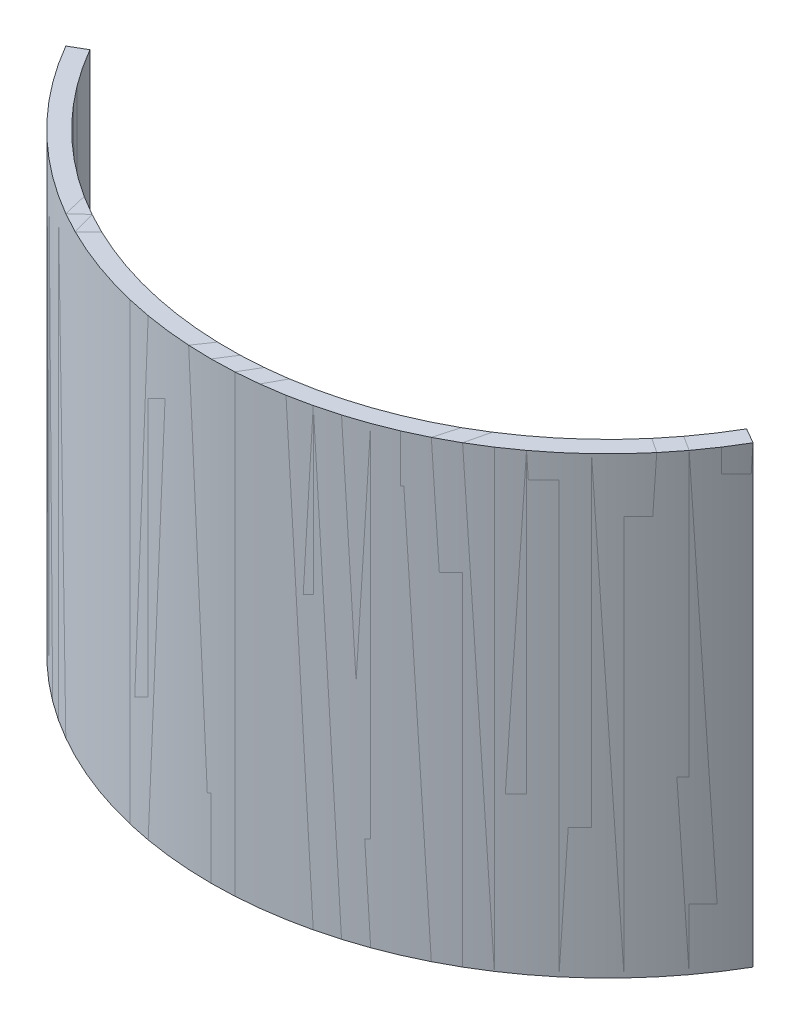
ISO-10303-21;
HEADER;
FILE_DESCRIPTION(('STEP AP214'),'2;1');
FILE_NAME('part.step','',(''),(''),'','','');
FILE_SCHEMA(('AUTOMOTIVE_DESIGN { 1 0 10303 214 1 1 1 1 }'));
ENDSEC;
DATA;
#1=APPLICATION_CONTEXT('core data for automotive mechanical design processes');
#2=APPLICATION_PROTOCOL_DEFINITION('international standard','automotive_design',2000,#1);
#3=PRODUCT_CONTEXT('',#1,'mechanical');
#4=PRODUCT('Part','Part','',(#3));
#5=PRODUCT_RELATED_PRODUCT_CATEGORY('part','',(#4));
#6=PRODUCT_DEFINITION_FORMATION('','',#4);
#7=PRODUCT_DEFINITION_CONTEXT('part definition',#1,'design');
#8=PRODUCT_DEFINITION('design','',#6,#7);
#9=PRODUCT_DEFINITION_SHAPE('','',#8);
#10=(LENGTH_UNIT() NAMED_UNIT(*) SI_UNIT(.MILLI.,.METRE.));
#11=(NAMED_UNIT(*) PLANE_ANGLE_UNIT() SI_UNIT($,.RADIAN.));
#12=(NAMED_UNIT(*) SI_UNIT($,.STERADIAN.) SOLID_ANGLE_UNIT());
#13=UNCERTAINTY_MEASURE_WITH_UNIT(LENGTH_MEASURE(1.E-05),#10,'distance_accuracy_value','');
#14=(GEOMETRIC_REPRESENTATION_CONTEXT(3) GLOBAL_UNCERTAINTY_ASSIGNED_CONTEXT((#13)) GLOBAL_UNIT_ASSIGNED_CONTEXT((#10,
#11,#12)) REPRESENTATION_CONTEXT('',''));
#15=CARTESIAN_POINT('',(0.,0.,0.));
#16=DIRECTION('',(0.,0.,1.));
#17=DIRECTION('',(1.,0.,0.));
#18=AXIS2_PLACEMENT_3D('',#15,#16,#17);
#19=CARTESIAN_POINT('',(0.,0.,0.));
#20=DIRECTION('',(0.499999999999998,0.,0.86602540378444));
#21=DIRECTION('',(0.86602540378444,0.,-0.499999999999998));
#22=AXIS2_PLACEMENT_3D('',#19,#20,#21);
#23=PLANE('',#22);
#24=DIRECTION('',(0.86602540378444,0.,-0.499999999999998));
#25=VECTOR('',#24,1.);
#26=CARTESIAN_POINT('',(-41.5692193816531,17.5,23.9999999999999));
#27=LINE('',#26,#25);
#28=CARTESIAN_POINT('',(-38.9711431702998,17.5,22.4999999999999));
#29=VERTEX_POINT('',#28);
#30=CARTESIAN_POINT('',(-37.2390923627309,17.5,21.4999999999999));
#31=VERTEX_POINT('',#30);
#32=EDGE_CURVE('E125',#29,#31,#27,.T.);
#33=ORIENTED_EDGE('',*,*,#32,.F.);
#34=DIRECTION('',(0.,-1.,0.));
#35=VECTOR('',#34,1.);
#36=CARTESIAN_POINT('',(-38.9711431702998,2.,22.4999999999999));
#37=LINE('',#36,#35);
#38=CARTESIAN_POINT('',(-38.9711431702998,69.,22.4999999999999));
#39=VERTEX_POINT('',#38);
#40=EDGE_CURVE('E105',#29,#39,#37,.F.);
#41=ORIENTED_EDGE('',*,*,#40,.T.);
#42=DIRECTION('',(-0.86602540378444,0.,0.499999999999998));
#43=VECTOR('',#42,1.);
#44=CARTESIAN_POINT('',(-41.5692193816531,69.,23.9999999999999));
#45=LINE('',#44,#43);
#46=CARTESIAN_POINT('',(-37.2390923627309,69.,21.4999999999999));
#47=VERTEX_POINT('',#46);
#48=EDGE_CURVE('E117',#47,#39,#45,.T.);
#49=ORIENTED_EDGE('',*,*,#48,.F.);
#50=DIRECTION('',(0.,1.,0.));
#51=VECTOR('',#50,1.);
#52=CARTESIAN_POINT('',(-37.2390923627309,16.,21.4999999999999));
#53=LINE('',#52,#51);
#54=EDGE_CURVE('E96',#31,#47,#53,.T.);
#55=ORIENTED_EDGE('',*,*,#54,.F.);
#56=EDGE_LOOP('',(#33,#41,#49,#55));
#57=FACE_BOUND('',#56,.T.);
#58=ADVANCED_FACE('F47',(#57),#23,.F.);
#59=CARTESIAN_POINT('',(0.,0.,0.));
#60=DIRECTION('',(0.499999999999998,0.,-0.86602540378444));
#61=DIRECTION('',(-0.86602540378444,0.,-0.499999999999998));
#62=AXIS2_PLACEMENT_3D('',#59,#60,#61);
#63=PLANE('',#62);
#64=DIRECTION('',(0.,-1.,0.));
#65=VECTOR('',#64,1.);
#66=CARTESIAN_POINT('',(38.9711431702998,2.,22.4999999999999));
#67=LINE('',#66,#65);
#68=CARTESIAN_POINT('',(38.9711431702998,17.5,22.4999999999999));
#69=VERTEX_POINT('',#68);
#70=CARTESIAN_POINT('',(38.9711431702998,69.,22.4999999999999));
#71=VERTEX_POINT('',#70);
#72=EDGE_CURVE('E72',#69,#71,#67,.F.);
#73=ORIENTED_EDGE('',*,*,#72,.F.);
#74=DIRECTION('',(-0.86602540378444,0.,-0.499999999999998));
#75=VECTOR('',#74,1.);
#76=CARTESIAN_POINT('',(41.5692193816531,17.5,23.9999999999999));
#77=LINE('',#76,#75);
#78=CARTESIAN_POINT('',(37.2390923627309,17.5,21.4999999999999));
#79=VERTEX_POINT('',#78);
#80=EDGE_CURVE('E12',#69,#79,#77,.T.);
#81=ORIENTED_EDGE('',*,*,#80,.T.);
#82=DIRECTION('',(0.,1.,0.));
#83=VECTOR('',#82,1.);
#84=CARTESIAN_POINT('',(37.2390923627309,16.,21.4999999999999));
#85=LINE('',#84,#83);
#86=CARTESIAN_POINT('',(37.2390923627309,69.,21.4999999999999));
#87=VERTEX_POINT('',#86);
#88=EDGE_CURVE('E65',#79,#87,#85,.T.);
#89=ORIENTED_EDGE('',*,*,#88,.T.);
#90=DIRECTION('',(0.86602540378444,0.,0.499999999999998));
#91=VECTOR('',#90,1.);
#92=CARTESIAN_POINT('',(41.5692193816531,69.,23.9999999999999));
#93=LINE('',#92,#91);
#94=EDGE_CURVE('E57',#87,#71,#93,.T.);
#95=ORIENTED_EDGE('',*,*,#94,.T.);
#96=EDGE_LOOP('',(#73,#81,#89,#95));
#97=FACE_BOUND('',#96,.T.);
#98=ADVANCED_FACE('F91',(#97),#63,.T.);
#99=CARTESIAN_POINT('',(-41.5692193816531,17.5,23.9999999999999));
#100=DIRECTION('',(0.,-1.,0.));
#101=DIRECTION('',(0.,0.,-1.));
#102=AXIS2_PLACEMENT_3D('',#99,#100,#101);
#103=PLANE('',#102);
#104=CARTESIAN_POINT('',(0.,17.5,0.));
#105=DIRECTION('',(0.,-1.,0.));
#106=DIRECTION('',(0.,0.,-1.));
#107=AXIS2_PLACEMENT_3D('',#104,#105,#106);
#108=CIRCLE('',#107,45.);
#109=EDGE_CURVE('E102',#29,#69,#108,.F.);
#110=ORIENTED_EDGE('',*,*,#109,.F.);
#111=ORIENTED_EDGE('',*,*,#32,.T.);
#112=CARTESIAN_POINT('',(0.,17.5,0.));
#113=DIRECTION('',(0.,-1.,0.));
#114=DIRECTION('',(0.,0.,-1.));
#115=AXIS2_PLACEMENT_3D('',#112,#113,#114);
#116=CIRCLE('',#115,43.);
#117=EDGE_CURVE('E103',#31,#79,#116,.F.);
#118=ORIENTED_EDGE('',*,*,#117,.T.);
#119=ORIENTED_EDGE('',*,*,#80,.F.);
#120=EDGE_LOOP('',(#110,#111,#118,#119));
#121=FACE_BOUND('',#120,.T.);
#122=ADVANCED_FACE('F100',(#121),#103,.T.);
#123=CARTESIAN_POINT('',(0.,69.,0.));
#124=DIRECTION('',(0.,1.,0.));
#125=DIRECTION('',(0.,0.,1.));
#126=AXIS2_PLACEMENT_3D('',#123,#124,#125);
#127=PLANE('',#126);
#128=ORIENTED_EDGE('',*,*,#48,.T.);
#129=CARTESIAN_POINT('',(0.,69.,0.));
#130=DIRECTION('',(0.,1.,0.));
#131=DIRECTION('',(0.,0.,1.));
#132=AXIS2_PLACEMENT_3D('',#129,#130,#131);
#133=CIRCLE('',#132,45.);
#134=EDGE_CURVE('E107',#71,#39,#133,.F.);
#135=ORIENTED_EDGE('',*,*,#134,.F.);
#136=ORIENTED_EDGE('',*,*,#94,.F.);
#137=CARTESIAN_POINT('',(0.,69.,0.));
#138=DIRECTION('',(0.,1.,0.));
#139=DIRECTION('',(-0.86602540378444,0.,0.499999999999998));
#140=AXIS2_PLACEMENT_3D('',#137,#138,#139);
#141=CIRCLE('',#140,43.);
#142=EDGE_CURVE('E51',#47,#87,#141,.T.);
#143=ORIENTED_EDGE('',*,*,#142,.F.);
#144=EDGE_LOOP('',(#128,#135,#136,#143));
#145=FACE_BOUND('',#144,.T.);
#146=ADVANCED_FACE('F141',(#145),#127,.T.);
#147=CARTESIAN_POINT('',(0.,17.5,0.));
#148=DIRECTION('',(0.,1.,0.));
#149=DIRECTION('',(0.,0.,1.));
#150=AXIS2_PLACEMENT_3D('',#147,#148,#149);
#151=CYLINDRICAL_SURFACE('',#150,45.);
#152=ORIENTED_EDGE('',*,*,#109,.T.);
#153=ORIENTED_EDGE('',*,*,#72,.T.);
#154=ORIENTED_EDGE('',*,*,#134,.T.);
#155=ORIENTED_EDGE('',*,*,#40,.F.);
#156=EDGE_LOOP('',(#152,#153,#154,#155));
#157=FACE_BOUND('',#156,.T.);
#158=ADVANCED_FACE('F104',(#157),#151,.T.);
#159=CARTESIAN_POINT('',(0.,17.5,0.));
#160=DIRECTION('',(0.,1.,0.));
#161=DIRECTION('',(0.,0.,1.));
#162=AXIS2_PLACEMENT_3D('',#159,#160,#161);
#163=CYLINDRICAL_SURFACE('',#162,43.);
#164=ORIENTED_EDGE('',*,*,#142,.T.);
#165=ORIENTED_EDGE('',*,*,#88,.F.);
#166=ORIENTED_EDGE('',*,*,#117,.F.);
#167=ORIENTED_EDGE('',*,*,#54,.T.);
#168=EDGE_LOOP('',(#164,#165,#166,#167));
#169=FACE_BOUND('',#168,.T.);
#170=ADVANCED_FACE('F49',(#169),#163,.F.);
#171=CLOSED_SHELL('',(#58,#98,#122,#146,#158,#170));
#172=MANIFOLD_SOLID_BREP('B2',#171);
#173=CARTESIAN_POINT('',(-37.2390923627309,69.,21.4999999999999));
#174=DIRECTION('',(0.,1.,0.));
#175=DIRECTION('',(0.,0.,1.));
#176=AXIS2_PLACEMENT_3D('',#173,#174,#175);
#177=PLANE('',#176);
#178=DIRECTION('',(0.86602540378444,0.,0.499999999999998));
#179=VECTOR('',#178,1.);
#180=CARTESIAN_POINT('',(37.2390923627309,69.,21.4999999999999));
#181=LINE('',#180,#179);
#182=CARTESIAN_POINT('',(37.2390923627309,69.,21.4999999999999));
#183=VERTEX_POINT('',#182);
#184=CARTESIAN_POINT('',(38.9711431702998,69.,22.4999999999999));
#185=VERTEX_POINT('',#184);
#186=EDGE_CURVE('E45',#183,#185,#181,.T.);
#187=ORIENTED_EDGE('',*,*,#186,.F.);
#188=CARTESIAN_POINT('',(0.,69.,0.));
#189=DIRECTION('',(0.,1.,0.));
#190=DIRECTION('',(-0.86602540378444,0.,0.499999999999998));
#191=AXIS2_PLACEMENT_3D('',#188,#189,#190);
#192=CIRCLE('',#191,43.);
#193=CARTESIAN_POINT('',(-37.2390923627309,69.,21.4999999999999));
#194=VERTEX_POINT('',#193);
#195=EDGE_CURVE('E201',#194,#183,#192,.T.);
#196=ORIENTED_EDGE('',*,*,#195,.F.);
#197=DIRECTION('',(-0.86602540378444,0.,0.499999999999998));
#198=VECTOR('',#197,1.);
#199=CARTESIAN_POINT('',(-37.2390923627309,69.,21.4999999999999));
#200=LINE('',#199,#198);
#201=CARTESIAN_POINT('',(-38.9711431702998,69.,22.4999999999999));
#202=VERTEX_POINT('',#201);
#203=EDGE_CURVE('E247',#194,#202,#200,.T.);
#204=ORIENTED_EDGE('',*,*,#203,.T.);
#205=CARTESIAN_POINT('',(0.,69.,0.));
#206=DIRECTION('',(0.,1.,0.));
#207=DIRECTION('',(-0.86602540378444,0.,0.499999999999998));
#208=AXIS2_PLACEMENT_3D('',#205,#206,#207);
#209=CIRCLE('',#208,45.);
#210=EDGE_CURVE('E248',#202,#185,#209,.T.);
#211=ORIENTED_EDGE('',*,*,#210,.T.);
#212=EDGE_LOOP('',(#187,#196,#204,#211));
#213=FACE_BOUND('',#212,.T.);
#214=ADVANCED_FACE('F195',(#213),#177,.T.);
#215=CARTESIAN_POINT('',(0.,17.5,0.));
#216=DIRECTION('',(0.,1.,0.));
#217=DIRECTION('',(0.,0.,1.));
#218=AXIS2_PLACEMENT_3D('',#215,#216,#217);
#219=CYLINDRICAL_SURFACE('',#218,43.);
#220=ORIENTED_EDGE('',*,*,#195,.T.);
#221=DIRECTION('',(0.,1.,0.));
#222=VECTOR('',#221,1.);
#223=CARTESIAN_POINT('',(37.2390923627309,17.5,21.4999999999999));
#224=LINE('',#223,#222);
#225=CARTESIAN_POINT('',(37.2390923627309,17.5,21.4999999999999));
#226=VERTEX_POINT('',#225);
#227=EDGE_CURVE('E205',#226,#183,#224,.T.);
#228=ORIENTED_EDGE('',*,*,#227,.F.);
#229=CARTESIAN_POINT('',(0.,17.5,0.));
#230=DIRECTION('',(0.,1.,0.));
#231=DIRECTION('',(-0.86602540378444,0.,0.499999999999998));
#232=AXIS2_PLACEMENT_3D('',#229,#230,#231);
#233=CIRCLE('',#232,43.);
#234=CARTESIAN_POINT('',(-37.2390923627309,17.5,21.4999999999999));
#235=VERTEX_POINT('',#234);
#236=EDGE_CURVE('E264',#235,#226,#233,.T.);
#237=ORIENTED_EDGE('',*,*,#236,.F.);
#238=DIRECTION('',(0.,1.,0.));
#239=VECTOR('',#238,1.);
#240=CARTESIAN_POINT('',(-37.2390923627309,17.5,21.4999999999999));
#241=LINE('',#240,#239);
#242=EDGE_CURVE('E221',#235,#194,#241,.T.);
#243=ORIENTED_EDGE('',*,*,#242,.T.);
#244=EDGE_LOOP('',(#220,#228,#237,#243));
#245=FACE_BOUND('',#244,.T.);
#246=ADVANCED_FACE('F270',(#245),#219,.F.);
#247=CARTESIAN_POINT('',(-38.9711431702998,17.5,22.4999999999999));
#248=DIRECTION('',(0.,-1.,0.));
#249=DIRECTION('',(0.,0.,-1.));
#250=AXIS2_PLACEMENT_3D('',#247,#248,#249);
#251=PLANE('',#250);
#252=ORIENTED_EDGE('',*,*,#236,.T.);
#253=DIRECTION('',(-0.86602540378444,0.,-0.499999999999997));
#254=VECTOR('',#253,1.);
#255=CARTESIAN_POINT('',(38.9711431702998,17.5,22.4999999999999));
#256=LINE('',#255,#254);
#257=CARTESIAN_POINT('',(38.9711431702998,17.5,22.4999999999999));
#258=VERTEX_POINT('',#257);
#259=EDGE_CURVE('E261',#258,#226,#256,.T.);
#260=ORIENTED_EDGE('',*,*,#259,.F.);
#261=CARTESIAN_POINT('',(0.,17.5,0.));
#262=DIRECTION('',(0.,1.,0.));
#263=DIRECTION('',(-0.86602540378444,0.,0.499999999999998));
#264=AXIS2_PLACEMENT_3D('',#261,#262,#263);
#265=CIRCLE('',#264,45.);
#266=CARTESIAN_POINT('',(-38.9711431702998,17.5,22.4999999999999));
#267=VERTEX_POINT('',#266);
#268=EDGE_CURVE('E255',#267,#258,#265,.T.);
#269=ORIENTED_EDGE('',*,*,#268,.F.);
#270=DIRECTION('',(0.866025403784439,0.,-0.499999999999998));
#271=VECTOR('',#270,1.);
#272=CARTESIAN_POINT('',(-38.9711431702998,17.5,22.4999999999999));
#273=LINE('',#272,#271);
#274=EDGE_CURVE('E231',#267,#235,#273,.T.);
#275=ORIENTED_EDGE('',*,*,#274,.T.);
#276=EDGE_LOOP('',(#252,#260,#269,#275));
#277=FACE_BOUND('',#276,.T.);
#278=ADVANCED_FACE('F272',(#277),#251,.T.);
#279=CARTESIAN_POINT('',(0.,17.5,0.));
#280=DIRECTION('',(0.,1.,0.));
#281=DIRECTION('',(0.,0.,1.));
#282=AXIS2_PLACEMENT_3D('',#279,#280,#281);
#283=CYLINDRICAL_SURFACE('',#282,45.);
#284=ORIENTED_EDGE('',*,*,#268,.T.);
#285=DIRECTION('',(0.,-1.,0.));
#286=VECTOR('',#285,1.);
#287=CARTESIAN_POINT('',(38.9711431702998,69.,22.4999999999999));
#288=LINE('',#287,#286);
#289=EDGE_CURVE('E252',#185,#258,#288,.T.);
#290=ORIENTED_EDGE('',*,*,#289,.F.);
#291=ORIENTED_EDGE('',*,*,#210,.F.);
#292=DIRECTION('',(0.,-1.,0.));
#293=VECTOR('',#292,1.);
#294=CARTESIAN_POINT('',(-38.9711431702998,69.,22.4999999999999));
#295=LINE('',#294,#293);
#296=EDGE_CURVE('E239',#202,#267,#295,.T.);
#297=ORIENTED_EDGE('',*,*,#296,.T.);
#298=EDGE_LOOP('',(#284,#290,#291,#297));
#299=FACE_BOUND('',#298,.T.);
#300=ADVANCED_FACE('F250',(#299),#283,.T.);
#301=OPEN_SHELL('',(#214,#246,#278,#300));
#302=SHELL_BASED_SURFACE_MODEL('B6',(#301));
#303=ADVANCED_BREP_SHAPE_REPRESENTATION('',(#18,#172),#14);
#304=MANIFOLD_SURFACE_SHAPE_REPRESENTATION('',(#18,#302),#14);
#305=SHAPE_REPRESENTATION('',(#18),#14);
#306=SHAPE_DEFINITION_REPRESENTATION(#9,#305);
#307=SHAPE_REPRESENTATION_RELATIONSHIP('','',#305,#303);
#308=SHAPE_REPRESENTATION_RELATIONSHIP('','',#305,#304);
ENDSEC;
END-ISO-10303-21;
